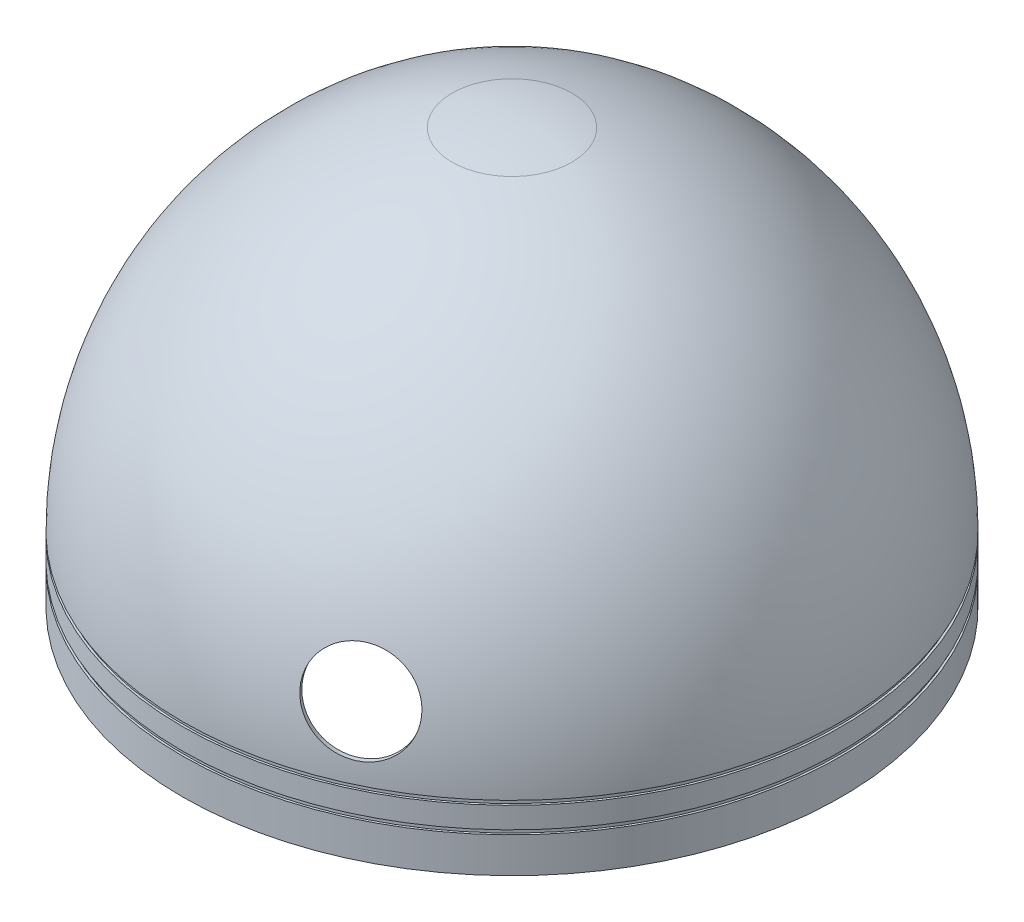
ISO-10303-21;
HEADER;
FILE_DESCRIPTION(('STEP AP214'),'2;1');
FILE_NAME('part.step','',(''),(''),'','','');
FILE_SCHEMA(('AUTOMOTIVE_DESIGN { 1 0 10303 214 1 1 1 1 }'));
ENDSEC;
DATA;
#1=APPLICATION_CONTEXT('core data for automotive mechanical design processes');
#2=APPLICATION_PROTOCOL_DEFINITION('international standard','automotive_design',2000,#1);
#3=PRODUCT_CONTEXT('',#1,'mechanical');
#4=PRODUCT('Part','Part','',(#3));
#5=PRODUCT_RELATED_PRODUCT_CATEGORY('part','',(#4));
#6=PRODUCT_DEFINITION_FORMATION('','',#4);
#7=PRODUCT_DEFINITION_CONTEXT('part definition',#1,'design');
#8=PRODUCT_DEFINITION('design','',#6,#7);
#9=PRODUCT_DEFINITION_SHAPE('','',#8);
#10=(LENGTH_UNIT() NAMED_UNIT(*) SI_UNIT(.MILLI.,.METRE.));
#11=(NAMED_UNIT(*) PLANE_ANGLE_UNIT() SI_UNIT($,.RADIAN.));
#12=(NAMED_UNIT(*) SI_UNIT($,.STERADIAN.) SOLID_ANGLE_UNIT());
#13=UNCERTAINTY_MEASURE_WITH_UNIT(LENGTH_MEASURE(1.E-05),#10,'distance_accuracy_value','');
#14=(GEOMETRIC_REPRESENTATION_CONTEXT(3) GLOBAL_UNCERTAINTY_ASSIGNED_CONTEXT((#13)) GLOBAL_UNIT_ASSIGNED_CONTEXT((#10,
#11,#12)) REPRESENTATION_CONTEXT('',''));
#15=CARTESIAN_POINT('',(0.,0.,0.));
#16=DIRECTION('',(0.,0.,1.));
#17=DIRECTION('',(1.,0.,0.));
#18=AXIS2_PLACEMENT_3D('',#15,#16,#17);
#19=CARTESIAN_POINT('',(0.,46.,0.));
#20=DIRECTION('',(0.,-1.,0.));
#21=DIRECTION('',(0.,0.,-1.));
#22=AXIS2_PLACEMENT_3D('',#19,#20,#21);
#23=DEGENERATE_TOROIDAL_SURFACE('',#22,22.5,255.,.F.);
#24=CARTESIAN_POINT('',(0.,46.,0.));
#25=DIRECTION('',(0.,-1.,0.));
#26=DIRECTION('',(0.,0.,-1.));
#27=AXIS2_PLACEMENT_3D('',#24,#25,#26);
#28=CIRCLE('',#27,232.5);
#29=CARTESIAN_POINT('',(0.,46.,-232.5));
#30=VERTEX_POINT('',#29);
#31=EDGE_CURVE('E62',#30,#30,#28,.T.);
#32=ORIENTED_EDGE('',*,*,#31,.F.);
#33=EDGE_LOOP('',(#32));
#34=FACE_BOUND('',#33,.T.);
#35=CARTESIAN_POINT('',(0.,292.64262416054,0.));
#36=DIRECTION('',(0.,-1.,0.));
#37=DIRECTION('',(0.,0.,-1.));
#38=AXIS2_PLACEMENT_3D('',#35,#36,#37);
#39=CIRCLE('',#38,42.2488683082783);
#40=CARTESIAN_POINT('',(0.,292.64262416054,-42.2488683082783));
#41=VERTEX_POINT('',#40);
#42=EDGE_CURVE('E65',#41,#41,#39,.T.);
#43=ORIENTED_EDGE('',*,*,#42,.T.);
#44=EDGE_LOOP('',(#43));
#45=FACE_BOUND('',#44,.T.);
#46=CARTESIAN_POINT('',(73.0852905135887,77.1056372596995,218.707390387912));
#47=CARTESIAN_POINT('',(72.6142991058594,77.9116920644069,218.760332252275));
#48=CARTESIAN_POINT('',(72.1733691378438,78.7364036291191,218.795213004151));
#49=CARTESIAN_POINT('',(71.3543738390453,80.4175248039797,218.828811779088));
#50=CARTESIAN_POINT('',(70.9763273788176,81.2739438352209,218.827518966538));
#51=CARTESIAN_POINT('',(70.2853893357592,83.0131198428163,218.788880998832));
#52=CARTESIAN_POINT('',(69.9725806129918,83.8959087055769,218.751490329948));
#53=CARTESIAN_POINT('',(69.4148325199988,85.6804113306996,218.64098649383));
#54=CARTESIAN_POINT('',(69.1698880333719,86.5821236608721,218.567876020722));
#55=CARTESIAN_POINT('',(68.7496475735868,88.3974491923617,218.386607902333));
#56=CARTESIAN_POINT('',(68.5742998842764,89.3110530339462,218.278476389486));
#57=CARTESIAN_POINT('',(68.2941906654185,91.1443814890517,218.02796306137));
#58=CARTESIAN_POINT('',(68.1894303583027,92.0641062082954,217.885580653003));
#59=CARTESIAN_POINT('',(68.0512715491557,93.9029071984951,217.56762962242));
#60=CARTESIAN_POINT('',(68.0178526124604,94.8219835797352,217.392070518858));
#61=CARTESIAN_POINT('',(68.0226114182422,96.6532558425231,217.008955895937));
#62=CARTESIAN_POINT('',(68.060788973484,97.5654517420581,216.801400460255));
#63=CARTESIAN_POINT('',(68.208820542687,99.3794835704076,216.354967222889));
#64=CARTESIAN_POINT('',(68.3189107380813,100.281275362627,216.11598829047));
#65=CARTESIAN_POINT('',(68.6103577486493,102.064930410807,215.608861087735));
#66=CARTESIAN_POINT('',(68.7917148896856,102.946793575627,215.340712684047));
#67=CARTESIAN_POINT('',(69.2245834092726,104.684210808669,214.777048953428));
#68=CARTESIAN_POINT('',(69.476097605069,105.539763818841,214.481532527818));
#69=CARTESIAN_POINT('',(70.0476657223329,107.218222605473,213.865146155114));
#70=CARTESIAN_POINT('',(70.36771914616,108.04112861892,213.544276392113));
#71=CARTESIAN_POINT('',(71.0718455330451,109.642669136805,212.881642465192));
#72=CARTESIAN_POINT('',(71.4554666828627,110.421567449093,212.540035841374));
#73=CARTESIAN_POINT('',(72.2856860668408,111.935290428501,211.836293176547));
#74=CARTESIAN_POINT('',(72.7322841482026,112.670115202548,211.474157185347));
#75=CARTESIAN_POINT('',(73.6853917436172,114.090073545438,210.73186699286));
#76=CARTESIAN_POINT('',(74.1918978854792,114.775209907715,210.351713806472));
#77=CARTESIAN_POINT('',(75.2613201581686,116.09054971911,209.576021265799));
#78=CARTESIAN_POINT('',(75.8242356329744,116.720753806914,209.18048209048));
#79=CARTESIAN_POINT('',(76.9938580080143,117.912506514406,208.382697967338));
#80=CARTESIAN_POINT('',(77.5998035973088,118.474924808068,207.980635832784));
#81=CARTESIAN_POINT('',(78.858341222423,119.53729360498,207.167088197503));
#82=CARTESIAN_POINT('',(79.5109328589334,120.037244642876,206.755602777463));
#83=CARTESIAN_POINT('',(80.8580630564391,120.97073105087,205.926145841129));
#84=CARTESIAN_POINT('',(81.5525986080913,121.404271177866,205.508174791752));
#85=CARTESIAN_POINT('',(82.978632533707,122.201537357501,204.66871398047));
#86=CARTESIAN_POINT('',(83.7101305238001,122.565264134992,204.247224255147));
#87=CARTESIAN_POINT('',(85.192945750485,123.214827722534,203.410434079361));
#88=CARTESIAN_POINT('',(85.9437691741716,123.501801386509,202.995140737116));
#89=CARTESIAN_POINT('',(87.4706426254793,124.003043978557,202.167062149556));
#90=CARTESIAN_POINT('',(88.246692382935,124.217313684983,201.754276877438));
#91=CARTESIAN_POINT('',(89.8183677381838,124.571446835554,200.934198460946));
#92=CARTESIAN_POINT('',(90.6139922617334,124.711314353331,200.526905017076));
#93=CARTESIAN_POINT('',(92.2190750723126,124.915549445045,199.720733115452));
#94=CARTESIAN_POINT('',(93.0285332913825,124.979917389775,199.32185461638));
#95=CARTESIAN_POINT('',(94.6469163520793,125.032368130474,198.539505805762));
#96=CARTESIAN_POINT('',(95.4557592167662,125.021237206121,198.155918403515));
#97=CARTESIAN_POINT('',(97.0754335155976,124.924625884319,197.402567031335));
#98=CARTESIAN_POINT('',(97.8862649333234,124.839146098687,197.032802947675));
#99=CARTESIAN_POINT('',(99.5041229866585,124.594507075474,196.309748569585));
#100=CARTESIAN_POINT('',(100.311149709457,124.435349534672,195.956457895983));
#101=CARTESIAN_POINT('',(101.915695242121,124.044592078444,195.26886157588));
#102=CARTESIAN_POINT('',(102.713214035241,123.812992035445,194.934555962814));
#103=CARTESIAN_POINT('',(104.292126013984,123.279476455129,194.28771509783));
#104=CARTESIAN_POINT('',(105.07353828129,122.977650031505,193.975152902173));
#105=CARTESIAN_POINT('',(106.615831178531,122.305831648252,193.373536916625));
#106=CARTESIAN_POINT('',(107.3767118625,121.93583986804,193.084483064861));
#107=CARTESIAN_POINT('',(108.872717553161,121.130484973927,192.531893494334));
#108=CARTESIAN_POINT('',(109.607842134731,120.69512078164,192.268358196644));
#109=CARTESIAN_POINT('',(111.047329420293,119.762283404891,191.768624632382));
#110=CARTESIAN_POINT('',(111.751691904593,119.264809776964,191.532426561023));
#111=CARTESIAN_POINT('',(113.130549439653,118.207121903506,191.087157385048));
#112=CARTESIAN_POINT('',(113.804753296036,117.646428059119,190.878323795044));
#113=CARTESIAN_POINT('',(115.112573516798,116.469802549059,190.491486422332));
#114=CARTESIAN_POINT('',(115.746189729441,115.8538706769,190.313482754876));
#115=CARTESIAN_POINT('',(116.968685938361,114.571233053424,189.989475646232));
#116=CARTESIAN_POINT('',(117.557563754316,113.904524830694,189.843473763995));
#117=CARTESIAN_POINT('',(118.686732801638,112.52515078863,189.584420415092));
#118=CARTESIAN_POINT('',(119.227023557266,111.812484519419,189.471369271038));
#119=CARTESIAN_POINT('',(120.263104415902,110.335496067643,189.277510665084));
#120=CARTESIAN_POINT('',(120.758127110846,109.570570327652,189.197199550571));
#121=CARTESIAN_POINT('',(121.691401933436,108.004086509149,189.071708194857));
#122=CARTESIAN_POINT('',(122.129653568934,107.202528113152,189.026528258191));
#123=CARTESIAN_POINT('',(122.946621702786,105.568396759023,188.971534923356));
#124=CARTESIAN_POINT('',(123.32533434014,104.735821793849,188.96172381789));
#125=CARTESIAN_POINT('',(124.020812176184,103.045515295408,188.977469998578));
#126=CARTESIAN_POINT('',(124.337576821956,102.187783537682,189.0030276004));
#127=CARTESIAN_POINT('',(124.911626822241,100.439554560554,189.089946108061));
#128=CARTESIAN_POINT('',(125.167908479203,99.5487550475417,189.151858686131));
#129=CARTESIAN_POINT('',(125.612909233174,97.7535837897332,189.311428126042));
#130=CARTESIAN_POINT('',(125.801627624584,96.8492119032961,189.409085361161));
#131=CARTESIAN_POINT('',(126.110305988791,95.0331708376848,189.639424500196));
#132=CARTESIAN_POINT('',(126.230262081004,94.1215012496099,189.772108380216));
#133=CARTESIAN_POINT('',(126.400624752574,92.2972587827914,190.071543766522));
#134=CARTESIAN_POINT('',(126.451031035544,91.384685900215,190.238295417985));
#135=CARTESIAN_POINT('',(126.482098849102,89.5558971023154,190.606518959681));
#136=CARTESIAN_POINT('',(126.462060219237,88.639735534327,190.808320344391));
#137=CARTESIAN_POINT('',(126.350766259508,86.8194473106212,191.244041942236));
#138=CARTESIAN_POINT('',(126.259510351093,85.9153207527339,191.477962416287));
#139=CARTESIAN_POINT('',(126.006309600814,84.1255257352129,191.976274030775));
#140=CARTESIAN_POINT('',(125.84436325174,83.2398576695594,192.240665820812));
#141=CARTESIAN_POINT('',(125.450763449825,81.4933558293742,192.798049289806));
#142=CARTESIAN_POINT('',(125.219110229198,80.632521972123,193.091040873488));
#143=CARTESIAN_POINT('',(124.68770095842,78.9424518144846,193.703359785774));
#144=CARTESIAN_POINT('',(124.387987546333,78.1131961093379,194.022670546606));
#145=CARTESIAN_POINT('',(123.722273370383,76.49179168609,194.685516508936));
#146=CARTESIAN_POINT('',(123.356272474134,75.6996430421013,195.029051758813));
#147=CARTESIAN_POINT('',(122.560363343068,74.1583762740306,195.737869136958));
#148=CARTESIAN_POINT('',(122.130457248368,73.4092567101153,196.103150536725));
#149=CARTESIAN_POINT('',(121.209569852987,71.9596939385254,196.852818814725));
#150=CARTESIAN_POINT('',(120.718589210347,71.2592502065251,197.237205487084));
#151=CARTESIAN_POINT('',(119.684996316558,69.9203697870752,198.017634542998));
#152=CARTESIAN_POINT('',(119.143060285802,69.2812999515424,198.41348632499));
#153=CARTESIAN_POINT('',(118.00643652056,68.0608630735105,199.218212973075));
#154=CARTESIAN_POINT('',(117.41174909266,67.4794956956913,199.627087763469));
#155=CARTESIAN_POINT('',(116.173768597162,66.3790470921774,200.45481627777));
#156=CARTESIAN_POINT('',(115.530479099832,65.8599612985635,200.873669267141));
#157=CARTESIAN_POINT('',(114.199790513834,64.8881611886825,201.718253071089));
#158=CARTESIAN_POINT('',(113.512392017598,64.4354459812536,202.143983793232));
#159=CARTESIAN_POINT('',(112.111092322036,63.6075301766288,202.991446734257));
#160=CARTESIAN_POINT('',(111.397885778105,63.231087113203,203.413114116282));
#161=CARTESIAN_POINT('',(109.938732632941,62.5487323437466,204.256873755104));
#162=CARTESIAN_POINT('',(109.192786406588,62.2428198303681,204.678966006983));
#163=CARTESIAN_POINT('',(107.673560953216,61.7040039123902,205.520411429884));
#164=CARTESIAN_POINT('',(106.900283805876,61.4710949660147,205.93976480645));
#165=CARTESIAN_POINT('',(105.331965248829,61.0801483413011,206.772634977329));
#166=CARTESIAN_POINT('',(104.536924036292,60.9221099849173,207.186151824465));
#167=CARTESIAN_POINT('',(102.943327327729,60.6840495926401,207.997935643664));
#168=CARTESIAN_POINT('',(102.145015693394,60.602860481818,208.396339500071));
#169=CARTESIAN_POINT('',(100.538681784324,60.5149563112155,209.181608478478));
#170=CARTESIAN_POINT('',(99.7306596191112,60.5082404122631,209.568473730447));
#171=CARTESIAN_POINT('',(98.1107816709208,60.5693326780011,210.327850358506));
#172=CARTESIAN_POINT('',(97.2989262123637,60.6371346447653,210.700362925695));
#173=CARTESIAN_POINT('',(95.6771555114884,60.8467113618495,211.428410785268));
#174=CARTESIAN_POINT('',(94.867240266294,60.9884860024471,211.783946102834));
#175=CARTESIAN_POINT('',(93.2596867328565,61.3438795143346,212.473593578715));
#176=CARTESIAN_POINT('',(92.4620050638447,61.5570909518039,212.807814713881));
#177=CARTESIAN_POINT('',(90.8799311861879,62.0538790016412,213.454704463827));
#178=CARTESIAN_POINT('',(90.0955389544867,62.337455491918,213.767373116002));
#179=CARTESIAN_POINT('',(88.5453183255677,62.9728687073243,214.36914128621));
#180=CARTESIAN_POINT('',(87.7794949481416,63.3247236640174,214.65823447983));
#181=CARTESIAN_POINT('',(86.2719324145275,64.0939551503834,215.210863354346));
#182=CARTESIAN_POINT('',(85.5301930492458,64.5113311110295,215.474399257166));
#183=CARTESIAN_POINT('',(84.0704620734242,65.4117939674726,215.976092779709));
#184=CARTESIAN_POINT('',(83.3526868845963,65.8953443898487,216.214048109318));
#185=CARTESIAN_POINT('',(81.9515558367359,66.9221608388053,216.660853956522));
#186=CARTESIAN_POINT('',(81.2682023803872,67.4654310255072,216.869702444212));
#187=CARTESIAN_POINT('',(79.9412433773295,68.6070632922519,217.256820480843));
#188=CARTESIAN_POINT('',(79.2975967583933,69.2053667942786,217.435121978471));
#189=CARTESIAN_POINT('',(78.0537055820757,70.4530140734412,217.760347353311));
#190=CARTESIAN_POINT('',(77.4534500303166,71.102344833706,217.907279197492));
#191=CARTESIAN_POINT('',(76.169883023385,72.5994234313692,218.198563191909));
#192=CARTESIAN_POINT('',(75.4983568336231,73.4589001021469,218.334865318921));
#193=CARTESIAN_POINT('',(74.2325086711955,75.2388936987014,218.558204722415));
#194=CARTESIAN_POINT('',(73.638186688837,76.159410616815,218.645242005084));
#195=CARTESIAN_POINT('',(73.0852905135887,77.1056372596995,218.707390387912));
#196=B_SPLINE_CURVE_WITH_KNOTS('',3,(#46,#47,#48,#49,#50,#51,#52,#53,#54,#55,#56,#57,#58,#59,
#60,#61,#62,#63,#64,#65,#66,#67,#68,#69,#70,#71,#72,#73,#74,#75,#76,#77,#78,#79,#80,#81,#82,#83,
#84,#85,#86,#87,#88,#89,#90,#91,#92,#93,#94,#95,#96,#97,#98,#99,#100,#101,#102,#103,#104,#105,
#106,#107,#108,#109,#110,#111,#112,#113,#114,#115,#116,#117,#118,#119,#120,#121,#122,#123,#124,
#125,#126,#127,#128,#129,#130,#131,#132,#133,#134,#135,#136,#137,#138,#139,#140,#141,#142,#143,
#144,#145,#146,#147,#148,#149,#150,#151,#152,#153,#154,#155,#156,#157,#158,#159,#160,#161,#162,
#163,#164,#165,#166,#167,#168,#169,#170,#171,#172,#173,#174,#175,#176,#177,#178,#179,#180,#181,
#182,#183,#184,#185,#186,#187,#188,#189,#190,#191,#192,#193,#194,#195),.UNSPECIFIED.,.T.,.F.,(4,
2,2,2,2,2,2,2,2,2,2,2,2,2,2,2,2,2,2,2,2,2,2,2,2,2,2,2,2,2,2,2,2,2,2,2,2,2,2,2,2,2,2,2,2,2,2,2,2,
2,2,2,2,2,2,2,2,2,2,2,2,2,2,2,2,2,2,2,2,2,2,2,2,2,4),(0.,2.80424075277096,5.6093215109017,
8.41794366057325,11.2263540057368,14.0326735460713,16.8390416849779,19.6446058739661,
22.4501627260082,25.264980463878,28.079811072438,30.8947547303773,33.7096779506487,
36.5053904890506,39.3010962444311,42.096644705948,44.8921606599501,47.6467709000434,
50.4013575623598,53.1557468260583,55.910107490151,58.6210739583956,61.3320114026807,
64.0428004038462,66.7535760917788,69.4361641915464,72.1187302164917,74.8012344656654,
77.4837434387699,80.1628668326609,82.8419831749852,85.5211437170312,88.2003233896212,
90.9014024506311,93.6024916090341,96.3037123204426,99.0049594778143,101.745758186974,
104.486580654418,107.227580786064,109.968605381356,112.752339878151,115.536103446154,
118.320024099753,121.10395661694,123.915636868552,126.727339961772,129.539103006967,
132.350856685467,135.160853704266,137.97085633513,140.780764883229,143.590643158909,
146.367426962014,149.144194627744,151.92075851231,154.697285112369,157.424111470247,
160.150906613184,162.877494712129,165.604058117982,168.288516738676,170.972945110577,
173.657150225547,176.341351359096,179.010496838626,181.679637686921,184.349492226373,
187.019323580369,189.708917120257,192.398698138023,195.085648544525,197.77191573083,
201.063810563499,204.355704982884),.UNSPECIFIED.);
#197=CARTESIAN_POINT('',(73.0852905135887,77.1056372596995,218.707390387912));
#198=VERTEX_POINT('',#197);
#199=EDGE_CURVE('E83',#198,#198,#196,.T.);
#200=ORIENTED_EDGE('',*,*,#199,.T.);
#201=EDGE_LOOP('',(#200));
#202=FACE_BOUND('',#201,.T.);
#203=ADVANCED_FACE('F32',(#34,#45,#202),#23,.F.);
#204=CARTESIAN_POINT('',(0.,46.,0.));
#205=DIRECTION('',(0.,-1.,0.));
#206=DIRECTION('',(0.,0.,-1.));
#207=AXIS2_PLACEMENT_3D('',#204,#205,#206);
#208=DEGENERATE_TOROIDAL_SURFACE('',#207,22.5,252.,.F.);
#209=CARTESIAN_POINT('',(0.,289.721422764929,0.));
#210=DIRECTION('',(0.,-1.,0.));
#211=DIRECTION('',(0.,0.,-1.));
#212=AXIS2_PLACEMENT_3D('',#209,#210,#211);
#213=CIRCLE('',#212,41.5614399263614);
#214=CARTESIAN_POINT('',(0.,289.721422764929,-41.5614399263614));
#215=VERTEX_POINT('',#214);
#216=EDGE_CURVE('E68',#215,#215,#213,.T.);
#217=ORIENTED_EDGE('',*,*,#216,.F.);
#218=EDGE_LOOP('',(#217));
#219=FACE_BOUND('',#218,.T.);
#220=CARTESIAN_POINT('',(0.,49.,0.));
#221=DIRECTION('',(0.,-1.,0.));
#222=DIRECTION('',(0.,0.,-1.));
#223=AXIS2_PLACEMENT_3D('',#220,#221,#222);
#224=CIRCLE('',#223,229.482142224404);
#225=CARTESIAN_POINT('',(0.,49.,-229.482142224404));
#226=VERTEX_POINT('',#225);
#227=EDGE_CURVE('E71',#226,#226,#224,.T.);
#228=ORIENTED_EDGE('',*,*,#227,.T.);
#229=EDGE_LOOP('',(#228));
#230=FACE_BOUND('',#229,.T.);
#231=CARTESIAN_POINT('',(72.0223762916923,76.6875744188868,215.929842622705));
#232=CARTESIAN_POINT('',(72.4943766135058,75.9049966681703,215.873624200532));
#233=CARTESIAN_POINT('',(72.9947956118039,75.14096083676,215.800089512171));
#234=CARTESIAN_POINT('',(74.0494692230302,73.6549365858882,215.618669913496));
#235=CARTESIAN_POINT('',(74.6037358780796,72.9329576297503,215.510777307267));
#236=CARTESIAN_POINT('',(75.7628515898006,71.535885296539,215.261066314741));
#237=CARTESIAN_POINT('',(76.3677488343075,70.8608377310368,215.119215364108));
#238=CARTESIAN_POINT('',(77.623554443564,69.5634078648473,214.802432296023));
#239=CARTESIAN_POINT('',(78.2744601580467,68.9410225351406,214.627502083095));
#240=CARTESIAN_POINT('',(79.6180818345888,67.7533659965547,214.245515202824));
#241=CARTESIAN_POINT('',(80.3108126266652,67.1881152382459,214.038447098913));
#242=CARTESIAN_POINT('',(81.7330446394502,66.1193228901671,213.593508202498));
#243=CARTESIAN_POINT('',(82.4625464482139,65.6157822877302,213.355636917282));
#244=CARTESIAN_POINT('',(83.952932127465,64.6744914900911,212.850696535478));
#245=CARTESIAN_POINT('',(84.7138079362929,64.23672452673,212.583634910691));
#246=CARTESIAN_POINT('',(86.261614766963,63.4303240475776,212.022056085223));
#247=CARTESIAN_POINT('',(87.0485453912517,63.0616894775118,211.727539303336));
#248=CARTESIAN_POINT('',(88.6320217023444,62.4009901065844,211.117202598618));
#249=CARTESIAN_POINT('',(89.4282975678263,62.1079661619653,210.801720715289));
#250=CARTESIAN_POINT('',(91.0348594468797,61.5944534462294,210.148193774189));
#251=CARTESIAN_POINT('',(91.8451453615979,61.3739641635359,209.810148875571));
#252=CARTESIAN_POINT('',(93.4737967663746,61.0073078477701,209.11389633155));
#253=CARTESIAN_POINT('',(94.2921619669797,60.8611381618573,208.755689406339));
#254=CARTESIAN_POINT('',(95.9309994401567,60.6443000394102,208.021678306467));
#255=CARTESIAN_POINT('',(96.7514716954189,60.5736309846079,207.645874275934));
#256=CARTESIAN_POINT('',(98.3774301266888,60.5088097725619,206.88458690381));
#257=CARTESIAN_POINT('',(99.1829690737002,60.5136374125712,206.499302750856));
#258=CARTESIAN_POINT('',(100.784459924987,60.5972874669432,205.717035380742));
#259=CARTESIAN_POINT('',(101.580411927531,60.6761091222034,205.320052283642));
#260=CARTESIAN_POINT('',(103.157033826481,60.9071157269522,204.517255025082));
#261=CARTESIAN_POINT('',(103.93770420546,61.0592983559032,204.111441143343));
#262=CARTESIAN_POINT('',(105.478265485618,61.4358214098316,203.293893751504));
#263=CARTESIAN_POINT('',(106.23815634431,61.660161982337,202.882160229301));
#264=CARTESIAN_POINT('',(107.730377394637,62.1787331042558,202.056541432104));
#265=CARTESIAN_POINT('',(108.462758325042,62.4728268460907,201.642661901079));
#266=CARTESIAN_POINT('',(109.896468228343,63.1288585120207,200.814910154229));
#267=CARTESIAN_POINT('',(110.597797308663,63.4907962013852,200.401037938382));
#268=CARTESIAN_POINT('',(111.964666322043,64.2797613962456,199.576217942887));
#269=CARTESIAN_POINT('',(112.630205443595,64.7067903767914,199.165270229733));
#270=CARTESIAN_POINT('',(113.921049275287,65.6227220733269,198.349184755769));
#271=CARTESIAN_POINT('',(114.546353620569,66.1116253502869,197.944047047671));
#272=CARTESIAN_POINT('',(115.758901073081,67.1530666843898,197.13822798233));
#273=CARTESIAN_POINT('',(116.345682177041,67.7062121271347,196.737636421062));
#274=CARTESIAN_POINT('',(117.470168596887,68.8678744235492,195.94804480094));
#275=CARTESIAN_POINT('',(118.007873670121,69.4763915509678,195.559044799404));
#276=CARTESIAN_POINT('',(119.030807579115,70.7444085860664,194.795289797918));
#277=CARTESIAN_POINT('',(119.516033110566,71.403911699536,194.420535695904));
#278=CARTESIAN_POINT('',(120.43094248302,72.7691583064287,193.687841699389));
#279=CARTESIAN_POINT('',(120.860625685335,73.4749023314391,193.329901998268));
#280=CARTESIAN_POINT('',(121.668901505911,74.9405168051133,192.627083310492));
#281=CARTESIAN_POINT('',(122.046457906732,75.7011230000528,192.282546589328));
#282=CARTESIAN_POINT('',(122.738989847935,77.2596659745272,191.615740017784));
#283=CARTESIAN_POINT('',(123.053964718422,78.0576031535532,191.293470405784));
#284=CARTESIAN_POINT('',(123.619443610835,79.6852554934138,190.673368090758));
#285=CARTESIAN_POINT('',(123.869942935722,80.5149729643856,190.375537169166));
#286=CARTESIAN_POINT('',(124.304954743802,82.2003779614323,189.806348531212));
#287=CARTESIAN_POINT('',(124.489466626313,83.0560657238367,189.534991055854));
#288=CARTESIAN_POINT('',(124.79397393347,84.8021344964839,189.016240459904));
#289=CARTESIAN_POINT('',(124.912830484229,85.6928570879166,188.769327895094));
#290=CARTESIAN_POINT('',(125.080511522883,87.4888275893438,188.306479547595));
#291=CARTESIAN_POINT('',(125.129335198697,88.3940756676488,188.090544124133));
#292=CARTESIAN_POINT('',(125.156692166052,90.2128115100847,187.69114776665));
#293=CARTESIAN_POINT('',(125.135221732591,91.1262997083154,187.50768855414));
#294=CARTESIAN_POINT('',(125.022155417472,92.9550947340934,187.174551170038));
#295=CARTESIAN_POINT('',(124.930559342786,93.87040156664,187.024873091434));
#296=CARTESIAN_POINT('',(124.676760714411,95.7042656507606,186.759237426607));
#297=CARTESIAN_POINT('',(124.513960623642,96.6227836837807,186.643579380201));
#298=CARTESIAN_POINT('',(124.118701066513,98.448627559506,186.4485815203));
#299=CARTESIAN_POINT('',(123.886241078159,99.3559533182893,186.369241978967));
#300=CARTESIAN_POINT('',(123.353169739216,101.152903553128,186.247504760738));
#301=CARTESIAN_POINT('',(123.052557874182,102.042527895509,186.205107362711));
#302=CARTESIAN_POINT('',(122.385145663523,103.797619093851,186.157628873015));
#303=CARTESIAN_POINT('',(122.018345665425,104.663086076625,186.152547585418));
#304=CARTESIAN_POINT('',(121.222254006756,106.360789071754,186.179771360128));
#305=CARTESIAN_POINT('',(120.793166903289,107.193122914187,186.211956361314));
#306=CARTESIAN_POINT('',(119.874470639345,108.821346682588,186.313366583945));
#307=CARTESIAN_POINT('',(119.384861466501,109.61723660111,186.382591812958));
#308=CARTESIAN_POINT('',(118.348437739437,111.166574457749,186.557658935911));
#309=CARTESIAN_POINT('',(117.801625573855,111.920024166033,186.66349930133));
#310=CARTESIAN_POINT('',(116.654522341398,113.378776792201,186.91110184443));
#311=CARTESIAN_POINT('',(116.054231868495,114.084080244682,187.052863623171));
#312=CARTESIAN_POINT('',(114.812475701816,115.432267276621,187.369263784739));
#313=CARTESIAN_POINT('',(114.171646121319,116.07584264159,187.543451209152));
#314=CARTESIAN_POINT('',(112.846385518873,117.30584721192,187.92466641891));
#315=CARTESIAN_POINT('',(112.161954801985,117.892276817036,188.131693974501));
#316=CARTESIAN_POINT('',(110.754349282174,119.003387302183,188.577107397731));
#317=CARTESIAN_POINT('',(110.031177182493,119.528072482386,188.815491079131));
#318=CARTESIAN_POINT('',(108.551213378817,120.511593481397,189.321904203015));
#319=CARTESIAN_POINT('',(107.794422068304,120.970430070635,189.589933298582));
#320=CARTESIAN_POINT('',(106.265500418746,121.811546981856,190.148989396463));
#321=CARTESIAN_POINT('',(105.493832429675,122.194970458558,190.439561421393));
#322=CARTESIAN_POINT('',(103.928781933987,122.891579527694,191.045375993774));
#323=CARTESIAN_POINT('',(103.135399661769,123.204765877975,191.360618274986));
#324=CARTESIAN_POINT('',(101.532679353111,123.75840415309,192.013458791259));
#325=CARTESIAN_POINT('',(100.723342351123,123.998860777062,192.351055580255));
#326=CARTESIAN_POINT('',(99.0945439630852,124.405145980912,193.046147907107));
#327=CARTESIAN_POINT('',(98.2750826500273,124.570975098493,193.403643301569));
#328=CARTESIAN_POINT('',(96.6427911332374,124.825001630516,194.131104532127));
#329=CARTESIAN_POINT('',(95.8300144450689,124.914186352837,194.500846015927));
#330=CARTESIAN_POINT('',(94.2062673688128,125.017873915744,195.254485153104));
#331=CARTESIAN_POINT('',(93.395296963204,125.032377483933,195.638382668526));
#332=CARTESIAN_POINT('',(91.7810114847409,124.98659049299,196.417563023044));
#333=CARTESIAN_POINT('',(90.9776961312191,124.926302686752,196.812845442567));
#334=CARTESIAN_POINT('',(89.3844548319265,124.731411619934,197.611979097236));
#335=CARTESIAN_POINT('',(88.5945288802816,124.59680839196,198.015830328622));
#336=CARTESIAN_POINT('',(87.0373421964522,124.255137045091,198.827337379852));
#337=CARTESIAN_POINT('',(86.2699933763127,124.048407715832,199.234966887029));
#338=CARTESIAN_POINT('',(84.7595782942507,123.563966285354,200.053008476825));
#339=CARTESIAN_POINT('',(84.0165119152825,123.28625452634,200.463420546019));
#340=CARTESIAN_POINT('',(82.5598547148453,122.66197636675,201.28418358172));
#341=CARTESIAN_POINT('',(81.8462640435975,122.315409615312,201.694534547904));
#342=CARTESIAN_POINT('',(80.4535014033647,121.556055066947,202.512359872507));
#343=CARTESIAN_POINT('',(79.7743296310808,121.143266891627,202.919834214474));
#344=CARTESIAN_POINT('',(78.4515486490681,120.252211060386,203.731294335301));
#345=CARTESIAN_POINT('',(77.808147387895,119.773607402638,204.135250107765));
#346=CARTESIAN_POINT('',(76.5652127204237,118.756199682281,204.934734112335));
#347=CARTESIAN_POINT('',(75.9656793889192,118.217395517035,205.330262330071));
#348=CARTESIAN_POINT('',(74.8144733339678,117.083547371288,206.110274946997));
#349=CARTESIAN_POINT('',(74.262802649228,116.488500997406,206.49475887529));
#350=CARTESIAN_POINT('',(73.2109787803299,115.246522128156,207.250144266467));
#351=CARTESIAN_POINT('',(72.7108260830645,114.599589142512,207.621045600963));
#352=CARTESIAN_POINT('',(71.7589737343886,113.249547958971,208.351698437921));
#353=CARTESIAN_POINT('',(71.3080075201475,112.545806726298,208.711235855225));
#354=CARTESIAN_POINT('',(70.4652204190913,111.09491624549,209.411543276073));
#355=CARTESIAN_POINT('',(70.0733999848703,110.347766665249,209.752313135992));
#356=CARTESIAN_POINT('',(69.3513843406105,108.815374740256,210.412887656071));
#357=CARTESIAN_POINT('',(69.0211906657212,108.030131447189,210.732691793837));
#358=CARTESIAN_POINT('',(68.4244866953287,106.427088812566,211.349278141108));
#359=CARTESIAN_POINT('',(68.1579769670806,105.609289181095,211.646060145532));
#360=CARTESIAN_POINT('',(67.6864445719882,103.933262524195,212.219345670062));
#361=CARTESIAN_POINT('',(67.4824933123591,103.07459413581,212.495440499146));
#362=CARTESIAN_POINT('',(67.1432634829212,101.335552323029,213.020098078439));
#363=CARTESIAN_POINT('',(67.0079858879692,100.455178590701,213.268660437774));
#364=CARTESIAN_POINT('',(66.8068535003112,98.6786127324874,213.736696683868));
#365=CARTESIAN_POINT('',(66.7410202341884,97.7824157891481,213.956161532465));
#366=CARTESIAN_POINT('',(66.679183423903,95.9806996440665,214.364462937198));
#367=CARTESIAN_POINT('',(66.6831792904974,95.0751805210526,214.553299751771));
#368=CARTESIAN_POINT('',(66.7614124775349,93.2489654677801,214.901388830444));
#369=CARTESIAN_POINT('',(66.8365840721263,92.3282279611475,215.060213836882));
#370=CARTESIAN_POINT('',(67.0579618855994,90.4900206384488,215.344012219414));
#371=CARTESIAN_POINT('',(67.2041732352002,89.5725510632253,215.468983149443));
#372=CARTESIAN_POINT('',(67.5664402157993,87.7483403531751,215.68403038932));
#373=CARTESIAN_POINT('',(67.7824235604377,86.8415891172591,215.774142602671));
#374=CARTESIAN_POINT('',(68.2827182209856,85.0445671888304,215.918927955018));
#375=CARTESIAN_POINT('',(68.5670125111571,84.1542924491906,215.973609912074));
#376=CARTESIAN_POINT('',(69.2982897423028,82.1300268603499,216.058182607237));
#377=CARTESIAN_POINT('',(69.7684708181912,81.0037926977278,216.075567296396));
#378=CARTESIAN_POINT('',(70.8164503772944,78.8032847200786,216.048804454972));
#379=CARTESIAN_POINT('',(71.3942490541204,77.7290109985361,216.004656813687));
#380=CARTESIAN_POINT('',(72.0223762916923,76.6875744188868,215.929842622705));
#381=B_SPLINE_CURVE_WITH_KNOTS('',3,(#231,#232,#233,#234,#235,#236,#237,#238,#239,#240,#241,
#242,#243,#244,#245,#246,#247,#248,#249,#250,#251,#252,#253,#254,#255,#256,#257,#258,#259,#260,
#261,#262,#263,#264,#265,#266,#267,#268,#269,#270,#271,#272,#273,#274,#275,#276,#277,#278,#279,
#280,#281,#282,#283,#284,#285,#286,#287,#288,#289,#290,#291,#292,#293,#294,#295,#296,#297,#298,
#299,#300,#301,#302,#303,#304,#305,#306,#307,#308,#309,#310,#311,#312,#313,#314,#315,#316,#317,
#318,#319,#320,#321,#322,#323,#324,#325,#326,#327,#328,#329,#330,#331,#332,#333,#334,#335,#336,
#337,#338,#339,#340,#341,#342,#343,#344,#345,#346,#347,#348,#349,#350,#351,#352,#353,#354,#355,
#356,#357,#358,#359,#360,#361,#362,#363,#364,#365,#366,#367,#368,#369,#370,#371,#372,#373,#374,
#375,#376,#377,#378,#379,#380),.UNSPECIFIED.,.T.,.F.,(4,2,2,2,2,2,2,2,2,2,2,2,2,2,2,2,2,2,2,2,2,
2,2,2,2,2,2,2,2,2,2,2,2,2,2,2,2,2,2,2,2,2,2,2,2,2,2,2,2,2,2,2,2,2,2,2,2,2,2,2,2,2,2,2,2,2,2,2,2,
2,2,2,2,2,4),(0.,2.74585054203023,5.49231656701493,8.24142693914903,10.9903790806804,
13.7403117149073,16.4902883410024,19.2395627013503,21.9887951316363,24.7012166663562,
27.413619070337,30.1259246482282,32.8382080151223,35.5138717734394,38.189508082494,
40.8650597619804,43.5406169117095,46.2109692374019,48.8813123242148,51.5517159333358,
54.2221437548466,56.9202673111326,59.618404207256,62.3167108893575,65.0150485967522,
67.7610369127906,70.507054621284,73.2532723204442,75.9995150176614,78.7920080070826,
81.5845333772099,84.3772067303458,87.1698877707251,89.9864683842004,92.8030701041134,
95.6196930858694,98.4363012790657,101.243860371077,104.051420036689,106.858862513099,
109.666273811664,112.437219108057,115.208145019304,117.978877835911,120.749578232227,
123.474341123612,126.19907461381,128.923632018695,131.648169792394,134.337061084189,
137.025926178664,139.714692305376,142.403457252448,145.079758929336,147.756047704074,
150.432350116677,153.108667822398,155.799194357104,158.489725478987,161.180371147703,
163.871042243193,166.59752277434,169.324024167947,172.050593470835,174.777187059316,
177.548160363749,180.31917300243,183.0910443566,185.862892320747,188.671636280211,
191.48058312634,194.286629083345,197.091976388951,200.746084941614,204.400200068325),.UNSPECIFIED.);
#382=CARTESIAN_POINT('',(72.0223762916923,76.6875744188868,215.929842622705));
#383=VERTEX_POINT('',#382);
#384=EDGE_CURVE('E36',#383,#383,#381,.T.);
#385=ORIENTED_EDGE('',*,*,#384,.T.);
#386=EDGE_LOOP('',(#385));
#387=FACE_BOUND('',#386,.T.);
#388=ADVANCED_FACE('F109',(#219,#230,#387),#208,.T.);
#389=CARTESIAN_POINT('',(232.5,25.,0.));
#390=DIRECTION('',(0.,1.,0.));
#391=DIRECTION('',(0.,0.,1.));
#392=AXIS2_PLACEMENT_3D('',#389,#390,#391);
#393=PLANE('',#392);
#394=CARTESIAN_POINT('',(0.,25.,0.));
#395=DIRECTION('',(0.,-1.,0.));
#396=DIRECTION('',(0.,0.,-1.));
#397=AXIS2_PLACEMENT_3D('',#394,#395,#396);
#398=CIRCLE('',#397,231.);
#399=CARTESIAN_POINT('',(0.,25.,-231.));
#400=VERTEX_POINT('',#399);
#401=EDGE_CURVE('E11',#400,#400,#398,.T.);
#402=ORIENTED_EDGE('',*,*,#401,.T.);
#403=EDGE_LOOP('',(#402));
#404=FACE_BOUND('',#403,.T.);
#405=CARTESIAN_POINT('',(0.,25.,0.));
#406=DIRECTION('',(0.,-1.,0.));
#407=DIRECTION('',(0.,0.,-1.));
#408=AXIS2_PLACEMENT_3D('',#405,#406,#407);
#409=CIRCLE('',#408,232.5);
#410=CARTESIAN_POINT('',(0.,25.,-232.5));
#411=VERTEX_POINT('',#410);
#412=EDGE_CURVE('E80',#411,#411,#409,.T.);
#413=ORIENTED_EDGE('',*,*,#412,.F.);
#414=EDGE_LOOP('',(#413));
#415=FACE_BOUND('',#414,.T.);
#416=ADVANCED_FACE('F34',(#404,#415),#393,.T.);
#417=CARTESIAN_POINT('',(0.,0.,0.));
#418=DIRECTION('',(0.,-1.,0.));
#419=DIRECTION('',(0.,0.,-1.));
#420=AXIS2_PLACEMENT_3D('',#417,#418,#419);
#421=CYLINDRICAL_SURFACE('',#420,231.);
#422=CARTESIAN_POINT('',(0.,28.,0.));
#423=DIRECTION('',(0.,-1.,0.));
#424=DIRECTION('',(0.,0.,-1.));
#425=AXIS2_PLACEMENT_3D('',#422,#423,#424);
#426=CIRCLE('',#425,231.);
#427=CARTESIAN_POINT('',(0.,28.,-231.));
#428=VERTEX_POINT('',#427);
#429=EDGE_CURVE('E44',#428,#428,#426,.T.);
#430=ORIENTED_EDGE('',*,*,#429,.T.);
#431=EDGE_LOOP('',(#430));
#432=FACE_BOUND('',#431,.T.);
#433=ORIENTED_EDGE('',*,*,#401,.F.);
#434=EDGE_LOOP('',(#433));
#435=FACE_BOUND('',#434,.T.);
#436=ADVANCED_FACE('F161',(#432,#435),#421,.T.);
#437=CARTESIAN_POINT('',(231.,28.,0.));
#438=DIRECTION('',(0.,-1.,0.));
#439=DIRECTION('',(0.,0.,-1.));
#440=AXIS2_PLACEMENT_3D('',#437,#438,#439);
#441=PLANE('',#440);
#442=CARTESIAN_POINT('',(0.,28.,0.));
#443=DIRECTION('',(0.,-1.,0.));
#444=DIRECTION('',(0.,0.,-1.));
#445=AXIS2_PLACEMENT_3D('',#442,#443,#444);
#446=CIRCLE('',#445,232.5);
#447=CARTESIAN_POINT('',(0.,28.,-232.5));
#448=VERTEX_POINT('',#447);
#449=EDGE_CURVE('E48',#448,#448,#446,.T.);
#450=ORIENTED_EDGE('',*,*,#449,.T.);
#451=EDGE_LOOP('',(#450));
#452=FACE_BOUND('',#451,.T.);
#453=ORIENTED_EDGE('',*,*,#429,.F.);
#454=EDGE_LOOP('',(#453));
#455=FACE_BOUND('',#454,.T.);
#456=ADVANCED_FACE('F155',(#452,#455),#441,.T.);
#457=CARTESIAN_POINT('',(0.,0.,0.));
#458=DIRECTION('',(0.,-1.,0.));
#459=DIRECTION('',(0.,0.,-1.));
#460=AXIS2_PLACEMENT_3D('',#457,#458,#459);
#461=CYLINDRICAL_SURFACE('',#460,232.5);
#462=CARTESIAN_POINT('',(0.,43.,0.));
#463=DIRECTION('',(0.,-1.,0.));
#464=DIRECTION('',(0.,0.,-1.));
#465=AXIS2_PLACEMENT_3D('',#462,#463,#464);
#466=CIRCLE('',#465,232.5);
#467=CARTESIAN_POINT('',(0.,43.,-232.5));
#468=VERTEX_POINT('',#467);
#469=EDGE_CURVE('E53',#468,#468,#466,.T.);
#470=ORIENTED_EDGE('',*,*,#469,.T.);
#471=EDGE_LOOP('',(#470));
#472=FACE_BOUND('',#471,.T.);
#473=ORIENTED_EDGE('',*,*,#449,.F.);
#474=EDGE_LOOP('',(#473));
#475=FACE_BOUND('',#474,.T.);
#476=ADVANCED_FACE('F149',(#472,#475),#461,.T.);
#477=CARTESIAN_POINT('',(232.5,43.,0.));
#478=DIRECTION('',(0.,1.,0.));
#479=DIRECTION('',(0.,0.,1.));
#480=AXIS2_PLACEMENT_3D('',#477,#478,#479);
#481=PLANE('',#480);
#482=CARTESIAN_POINT('',(0.,43.,0.));
#483=DIRECTION('',(0.,-1.,0.));
#484=DIRECTION('',(0.,0.,-1.));
#485=AXIS2_PLACEMENT_3D('',#482,#483,#484);
#486=CIRCLE('',#485,231.);
#487=CARTESIAN_POINT('',(0.,43.,-231.));
#488=VERTEX_POINT('',#487);
#489=EDGE_CURVE('E56',#488,#488,#486,.T.);
#490=ORIENTED_EDGE('',*,*,#489,.T.);
#491=EDGE_LOOP('',(#490));
#492=FACE_BOUND('',#491,.T.);
#493=ORIENTED_EDGE('',*,*,#469,.F.);
#494=EDGE_LOOP('',(#493));
#495=FACE_BOUND('',#494,.T.);
#496=ADVANCED_FACE('F143',(#492,#495),#481,.T.);
#497=CARTESIAN_POINT('',(0.,0.,0.));
#498=DIRECTION('',(0.,-1.,0.));
#499=DIRECTION('',(0.,0.,-1.));
#500=AXIS2_PLACEMENT_3D('',#497,#498,#499);
#501=CYLINDRICAL_SURFACE('',#500,231.);
#502=CARTESIAN_POINT('',(0.,46.,0.));
#503=DIRECTION('',(0.,-1.,0.));
#504=DIRECTION('',(0.,0.,-1.));
#505=AXIS2_PLACEMENT_3D('',#502,#503,#504);
#506=CIRCLE('',#505,231.);
#507=CARTESIAN_POINT('',(0.,46.,-231.));
#508=VERTEX_POINT('',#507);
#509=EDGE_CURVE('E59',#508,#508,#506,.T.);
#510=ORIENTED_EDGE('',*,*,#509,.T.);
#511=EDGE_LOOP('',(#510));
#512=FACE_BOUND('',#511,.T.);
#513=ORIENTED_EDGE('',*,*,#489,.F.);
#514=EDGE_LOOP('',(#513));
#515=FACE_BOUND('',#514,.T.);
#516=ADVANCED_FACE('F123',(#512,#515),#501,.T.);
#517=CARTESIAN_POINT('',(231.,46.,0.));
#518=DIRECTION('',(0.,-1.,0.));
#519=DIRECTION('',(0.,0.,-1.));
#520=AXIS2_PLACEMENT_3D('',#517,#518,#519);
#521=PLANE('',#520);
#522=ORIENTED_EDGE('',*,*,#31,.T.);
#523=EDGE_LOOP('',(#522));
#524=FACE_BOUND('',#523,.T.);
#525=ORIENTED_EDGE('',*,*,#509,.F.);
#526=EDGE_LOOP('',(#525));
#527=FACE_BOUND('',#526,.T.);
#528=ADVANCED_FACE('F118',(#524,#527),#521,.T.);
#529=CARTESIAN_POINT('',(0.,90.,0.));
#530=DIRECTION('',(0.,-1.,0.));
#531=DIRECTION('',(1.,0.,0.));
#532=AXIS2_PLACEMENT_3D('',#529,#530,#531);
#533=SPHERICAL_SURFACE('',#532,207.);
#534=ORIENTED_EDGE('',*,*,#42,.F.);
#535=EDGE_LOOP('',(#534));
#536=FACE_BOUND('',#535,.T.);
#537=ADVANCED_FACE('F115',(#536),#533,.T.);
#538=CARTESIAN_POINT('',(0.,90.,0.));
#539=DIRECTION('',(0.,-1.,0.));
#540=DIRECTION('',(1.,0.,0.));
#541=AXIS2_PLACEMENT_3D('',#538,#539,#540);
#542=SPHERICAL_SURFACE('',#541,204.);
#543=ORIENTED_EDGE('',*,*,#216,.T.);
#544=EDGE_LOOP('',(#543));
#545=FACE_BOUND('',#544,.T.);
#546=ADVANCED_FACE('F107',(#545),#542,.F.);
#547=CARTESIAN_POINT('',(0.,0.,0.));
#548=DIRECTION('',(0.,-1.,0.));
#549=DIRECTION('',(0.,0.,-1.));
#550=AXIS2_PLACEMENT_3D('',#547,#548,#549);
#551=CYLINDRICAL_SURFACE('',#550,229.482142224404);
#552=CARTESIAN_POINT('',(0.,0.,0.));
#553=DIRECTION('',(0.,-1.,0.));
#554=DIRECTION('',(0.,0.,-1.));
#555=AXIS2_PLACEMENT_3D('',#552,#553,#554);
#556=CIRCLE('',#555,229.482142224404);
#557=CARTESIAN_POINT('',(0.,0.,-229.482142224404));
#558=VERTEX_POINT('',#557);
#559=EDGE_CURVE('E74',#558,#558,#556,.T.);
#560=ORIENTED_EDGE('',*,*,#559,.T.);
#561=EDGE_LOOP('',(#560));
#562=FACE_BOUND('',#561,.T.);
#563=ORIENTED_EDGE('',*,*,#227,.F.);
#564=EDGE_LOOP('',(#563));
#565=FACE_BOUND('',#564,.T.);
#566=ADVANCED_FACE('F104',(#562,#565),#551,.F.);
#567=CARTESIAN_POINT('',(229.482142224404,0.,0.));
#568=DIRECTION('',(0.,-1.,0.));
#569=DIRECTION('',(0.,0.,-1.));
#570=AXIS2_PLACEMENT_3D('',#567,#568,#569);
#571=PLANE('',#570);
#572=CARTESIAN_POINT('',(0.,0.,0.));
#573=DIRECTION('',(0.,-1.,0.));
#574=DIRECTION('',(0.,0.,-1.));
#575=AXIS2_PLACEMENT_3D('',#572,#573,#574);
#576=CIRCLE('',#575,232.5);
#577=CARTESIAN_POINT('',(0.,0.,-232.5));
#578=VERTEX_POINT('',#577);
#579=EDGE_CURVE('E77',#578,#578,#576,.T.);
#580=ORIENTED_EDGE('',*,*,#579,.T.);
#581=EDGE_LOOP('',(#580));
#582=FACE_BOUND('',#581,.T.);
#583=ORIENTED_EDGE('',*,*,#559,.F.);
#584=EDGE_LOOP('',(#583));
#585=FACE_BOUND('',#584,.T.);
#586=ADVANCED_FACE('F100',(#582,#585),#571,.T.);
#587=CARTESIAN_POINT('',(0.,0.,0.));
#588=DIRECTION('',(0.,-1.,0.));
#589=DIRECTION('',(0.,0.,-1.));
#590=AXIS2_PLACEMENT_3D('',#587,#588,#589);
#591=CYLINDRICAL_SURFACE('',#590,232.5);
#592=ORIENTED_EDGE('',*,*,#412,.T.);
#593=EDGE_LOOP('',(#592));
#594=FACE_BOUND('',#593,.T.);
#595=ORIENTED_EDGE('',*,*,#579,.F.);
#596=EDGE_LOOP('',(#595));
#597=FACE_BOUND('',#596,.T.);
#598=ADVANCED_FACE('F95',(#594,#597),#591,.T.);
#599=CARTESIAN_POINT('',(103.746903468293,92.77,217.509906391669));
#600=DIRECTION('',(-0.430511096808296,0.,-0.90258528434986));
#601=DIRECTION('',(-0.90258528434986,0.,0.430511096808296));
#602=AXIS2_PLACEMENT_3D('',#599,#600,#601);
#603=CYLINDRICAL_SURFACE('',#602,32.25);
#604=ORIENTED_EDGE('',*,*,#199,.F.);
#605=EDGE_LOOP('',(#604));
#606=FACE_BOUND('',#605,.T.);
#607=ORIENTED_EDGE('',*,*,#384,.F.);
#608=EDGE_LOOP('',(#607));
#609=FACE_BOUND('',#608,.T.);
#610=ADVANCED_FACE('F91',(#606,#609),#603,.F.);
#611=CLOSED_SHELL('',(#203,#388,#416,#436,#456,#476,#496,#516,#528,#537,#546,#566,#586,#598,#610));
#612=MANIFOLD_SOLID_BREP('B2',#611);
#613=ADVANCED_BREP_SHAPE_REPRESENTATION('',(#18,#612),#14);
#614=SHAPE_DEFINITION_REPRESENTATION(#9,#613);
ENDSEC;
END-ISO-10303-21;
